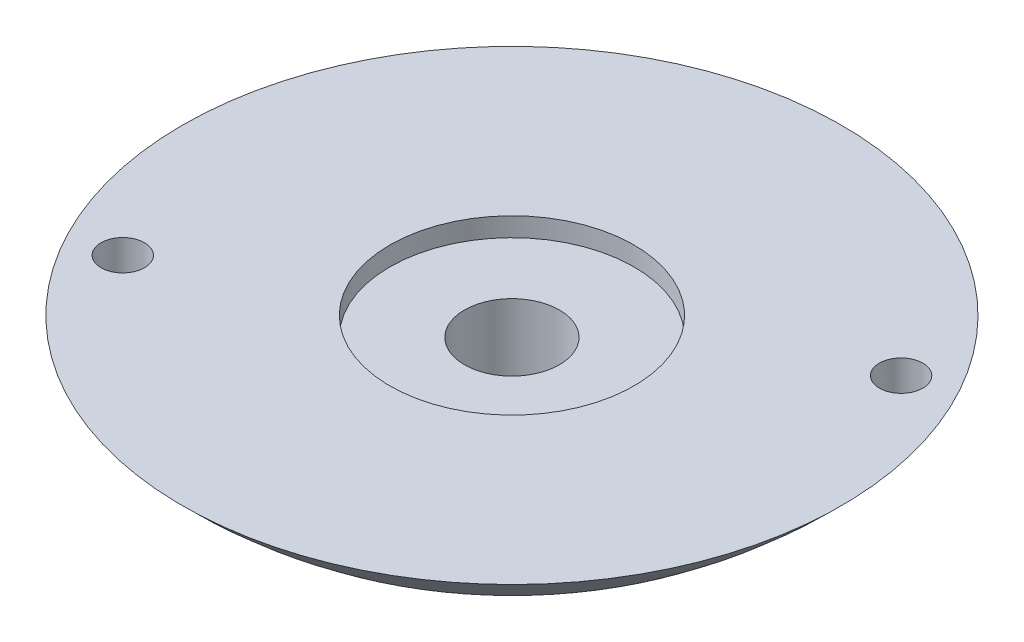
ISO-10303-21;
HEADER;
FILE_DESCRIPTION(('STEP AP214'),'2;1');
FILE_NAME('part.step','',(''),(''),'','','');
FILE_SCHEMA(('AUTOMOTIVE_DESIGN { 1 0 10303 214 1 1 1 1 }'));
ENDSEC;
DATA;
#1=APPLICATION_CONTEXT('core data for automotive mechanical design processes');
#2=APPLICATION_PROTOCOL_DEFINITION('international standard','automotive_design',2000,#1);
#3=PRODUCT_CONTEXT('',#1,'mechanical');
#4=PRODUCT('Part','Part','',(#3));
#5=PRODUCT_RELATED_PRODUCT_CATEGORY('part','',(#4));
#6=PRODUCT_DEFINITION_FORMATION('','',#4);
#7=PRODUCT_DEFINITION_CONTEXT('part definition',#1,'design');
#8=PRODUCT_DEFINITION('design','',#6,#7);
#9=PRODUCT_DEFINITION_SHAPE('','',#8);
#10=(LENGTH_UNIT() NAMED_UNIT(*) SI_UNIT(.MILLI.,.METRE.));
#11=(NAMED_UNIT(*) PLANE_ANGLE_UNIT() SI_UNIT($,.RADIAN.));
#12=(NAMED_UNIT(*) SI_UNIT($,.STERADIAN.) SOLID_ANGLE_UNIT());
#13=UNCERTAINTY_MEASURE_WITH_UNIT(LENGTH_MEASURE(1.E-05),#10,'distance_accuracy_value','');
#14=(GEOMETRIC_REPRESENTATION_CONTEXT(3) GLOBAL_UNCERTAINTY_ASSIGNED_CONTEXT((#13)) GLOBAL_UNIT_ASSIGNED_CONTEXT((#10,
#11,#12)) REPRESENTATION_CONTEXT('',''));
#15=CARTESIAN_POINT('',(0.,0.,0.));
#16=DIRECTION('',(0.,0.,1.));
#17=DIRECTION('',(1.,0.,0.));
#18=AXIS2_PLACEMENT_3D('',#15,#16,#17);
#19=CARTESIAN_POINT('',(0.,0.,0.));
#20=DIRECTION('',(0.,-1.,0.));
#21=DIRECTION('',(-1.,0.,0.));
#22=AXIS2_PLACEMENT_3D('',#19,#20,#21);
#23=SPHERICAL_SURFACE('',#22,33.8);
#24=CARTESIAN_POINT('',(0.,-33.618298588715,0.));
#25=DIRECTION('',(0.,1.,0.));
#26=DIRECTION('',(-1.,0.,0.));
#27=AXIS2_PLACEMENT_3D('',#24,#25,#26);
#28=CIRCLE('',#27,3.5);
#29=CARTESIAN_POINT('',(-3.50000000000002,-33.618298588715,0.));
#30=VERTEX_POINT('',#29);
#31=EDGE_CURVE('E49',#30,#30,#28,.T.);
#32=ORIENTED_EDGE('',*,*,#31,.T.);
#33=EDGE_LOOP('',(#32));
#34=FACE_BOUND('',#33,.T.);
#35=CARTESIAN_POINT('',(16.6632648097952,-27.2764650530501,-10.989543215638));
#36=CARTESIAN_POINT('',(16.6388819187034,-27.3219318471544,-10.9136629667709));
#37=CARTESIAN_POINT('',(16.6197224639966,-27.3650375875773,-10.8345727556679));
#38=CARTESIAN_POINT('',(16.5935628194061,-27.445002891596,-10.6711739972178));
#39=CARTESIAN_POINT('',(16.5865812124553,-27.4818528318753,-10.5868576776768));
#40=CARTESIAN_POINT('',(16.5864859069803,-27.5477613435103,-10.4143132907026));
#41=CARTESIAN_POINT('',(16.5934865381331,-27.5767534617525,-10.3260587904414));
#42=CARTESIAN_POINT('',(16.6228668625863,-27.6246059752164,-10.1493846298961));
#43=CARTESIAN_POINT('',(16.6452218445541,-27.6434825636246,-10.060965462328));
#44=CARTESIAN_POINT('',(16.7013385628951,-27.6678422187828,-9.89960608789244));
#45=CARTESIAN_POINT('',(16.7331267633537,-27.6748017833719,-9.82620044613975));
#46=CARTESIAN_POINT('',(16.8074919946921,-27.6795954683236,-9.68476053480524));
#47=CARTESIAN_POINT('',(16.8500638750466,-27.6774339374286,-9.61672372124072));
#48=CARTESIAN_POINT('',(16.9397813651417,-27.6648009517351,-9.4946198967781));
#49=CARTESIAN_POINT('',(16.986080422171,-27.6551574897174,-9.43983783509275));
#50=CARTESIAN_POINT('',(17.0846118894735,-27.6291055657775,-9.33776008975516));
#51=CARTESIAN_POINT('',(17.1368445890369,-27.6126967739141,-9.29046477138279));
#52=CARTESIAN_POINT('',(17.2478853337098,-27.5730821120982,-9.20224097849064));
#53=CARTESIAN_POINT('',(17.3068766552977,-27.54962155342,-9.16165983190306));
#54=CARTESIAN_POINT('',(17.4278440084385,-27.4971980430601,-9.08955472311624));
#55=CARTESIAN_POINT('',(17.4898212796001,-27.4682327911682,-9.05803456105565));
#56=CARTESIAN_POINT('',(17.6244482998425,-27.4012289331304,-8.9999376393957));
#57=CARTESIAN_POINT('',(17.6973403867625,-27.3624834942516,-8.97474442714659));
#58=CARTESIAN_POINT('',(17.843456856672,-27.2803490784833,-8.93538063505352));
#59=CARTESIAN_POINT('',(17.9166814151794,-27.2369572845756,-8.9212167856893));
#60=CARTESIAN_POINT('',(18.0768633315881,-27.1375008997389,-8.90133443057488));
#61=CARTESIAN_POINT('',(18.1636116682552,-27.0806454909543,-8.89789552339929));
#62=CARTESIAN_POINT('',(18.3340781636343,-26.9633385214959,-8.90453209257335));
#63=CARTESIAN_POINT('',(18.4177944060727,-26.9028847483247,-8.91461596733225));
#64=CARTESIAN_POINT('',(18.597779545109,-26.7668949074548,-8.95050327738525));
#65=CARTESIAN_POINT('',(18.6930830304221,-26.6908167103712,-8.97911632446392));
#66=CARTESIAN_POINT('',(18.8757432285345,-26.5369689784645,-9.05269235487884));
#67=CARTESIAN_POINT('',(18.963092351842,-26.4591979142795,-9.09767075269169));
#68=CARTESIAN_POINT('',(19.139983747697,-26.2924444337985,-9.21025479587591));
#69=CARTESIAN_POINT('',(19.2280518072025,-26.2034499244089,-9.28017707281213));
#70=CARTESIAN_POINT('',(19.3888716861302,-26.027861327424,-9.43835237997544));
#71=CARTESIAN_POINT('',(19.4616280557328,-25.9412665333655,-9.52659994893761));
#72=CARTESIAN_POINT('',(19.5759741563059,-25.7899507975781,-9.70118040558172));
#73=CARTESIAN_POINT('',(19.6208765673715,-25.7242648259357,-9.78451032994022));
#74=CARTESIAN_POINT('',(19.6961956910393,-25.5985205846387,-9.96136333700352));
#75=CARTESIAN_POINT('',(19.7266327741883,-25.5384544972555,-10.0548718562803));
#76=CARTESIAN_POINT('',(19.7653958103,-25.4389603214128,-10.2291976604673));
#77=CARTESIAN_POINT('',(19.7771000283295,-25.3978905954842,-10.3083232957681));
#78=CARTESIAN_POINT('',(19.7883238419953,-25.3226371486301,-10.4706396085337));
#79=CARTESIAN_POINT('',(19.7878578973697,-25.2884453045775,-10.5538253447312));
#80=CARTESIAN_POINT('',(19.7744715704847,-25.2338023953486,-10.7084601601696));
#81=CARTESIAN_POINT('',(19.763594161915,-25.2120199192301,-10.7796115172186));
#82=CARTESIAN_POINT('',(19.731710242437,-25.1758787971339,-10.9215541882542));
#83=CARTESIAN_POINT('',(19.7107094618765,-25.1615159607765,-10.9923456830602));
#84=CARTESIAN_POINT('',(19.6584393384792,-25.141132384262,-11.1317066656503));
#85=CARTESIAN_POINT('',(19.6271234946236,-25.1351500777844,-11.20026451689));
#86=CARTESIAN_POINT('',(19.5550168838905,-25.1321178906762,-11.3324150075984));
#87=CARTESIAN_POINT('',(19.5142277363598,-25.1350664844523,-11.396008493186));
#88=CARTESIAN_POINT('',(19.4281502801507,-25.1490888094048,-11.5115220096015));
#89=CARTESIAN_POINT('',(19.3834508602781,-25.1595189338355,-11.563963957611));
#90=CARTESIAN_POINT('',(19.2887591508307,-25.1871287962971,-11.661781137072));
#91=CARTESIAN_POINT('',(19.2387662362666,-25.2043093319821,-11.7071555325096));
#92=CARTESIAN_POINT('',(19.1320895134155,-25.2456482194559,-11.7926152542159));
#93=CARTESIAN_POINT('',(19.0751878830259,-25.2701430348443,-11.8322629515587));
#94=CARTESIAN_POINT('',(18.9587225067424,-25.3245158839058,-11.9029882451969));
#95=CARTESIAN_POINT('',(18.8991571405072,-25.3543972286215,-11.9340605403827));
#96=CARTESIAN_POINT('',(18.7513896128556,-25.4329671265632,-12.0000371976781));
#97=CARTESIAN_POINT('',(18.6623974407546,-25.484056740392,-12.0303405012513));
#98=CARTESIAN_POINT('',(18.484255882614,-25.5926594391868,-12.0747463347632));
#99=CARTESIAN_POINT('',(18.3951065575218,-25.6501857490757,-12.088814812156));
#100=CARTESIAN_POINT('',(18.1962827235211,-25.7847050483498,-12.1038071644664));
#101=CARTESIAN_POINT('',(18.0871284865329,-25.8629382436689,-12.1004993584796));
#102=CARTESIAN_POINT('',(17.874502421602,-26.023147646793,-12.0729404759186));
#103=CARTESIAN_POINT('',(17.7710319132501,-26.1051247157899,-12.0486845574981));
#104=CARTESIAN_POINT('',(17.5709384647648,-26.2713626328306,-11.9806455271013));
#105=CARTESIAN_POINT('',(17.4743902496609,-26.3556378058109,-11.9366783717097));
#106=CARTESIAN_POINT('',(17.2913325253916,-26.5237806282867,-11.830349760559));
#107=CARTESIAN_POINT('',(17.2048363416282,-26.6076475987515,-11.7679642677142));
#108=CARTESIAN_POINT('',(17.0379309694783,-26.7796236941441,-11.6199017554082));
#109=CARTESIAN_POINT('',(16.9586118419694,-26.8675123688059,-11.5327283269324));
#110=CARTESIAN_POINT('',(16.8192169440146,-27.0368989108538,-11.3393666450534));
#111=CARTESIAN_POINT('',(16.7590538968503,-27.1184244475566,-11.2332681708658));
#112=CARTESIAN_POINT('',(16.6934424624192,-27.2226964158969,-11.076852494087));
#113=CARTESIAN_POINT('',(16.677467505965,-27.2499812755504,-11.0337424090761));
#114=CARTESIAN_POINT('',(16.6632648097952,-27.2764650530501,-10.989543215638));
#115=B_SPLINE_CURVE_WITH_KNOTS('',3,(#35,#36,#37,#38,#39,#40,#41,#42,#43,#44,#45,#46,#47,#48,
#49,#50,#51,#52,#53,#54,#55,#56,#57,#58,#59,#60,#61,#62,#63,#64,#65,#66,#67,#68,#69,#70,#71,#72,
#73,#74,#75,#76,#77,#78,#79,#80,#81,#82,#83,#84,#85,#86,#87,#88,#89,#90,#91,#92,#93,#94,#95,#96,
#97,#98,#99,#100,#101,#102,#103,#104,#105,#106,#107,#108,#109,#110,#111,#112,#113,#114),
.UNSPECIFIED.,.T.,.F.,(4,2,2,2,2,2,2,2,2,2,2,2,2,2,2,2,2,2,2,2,2,2,2,2,2,2,2,2,2,2,2,2,2,2,2,2,
2,2,2,4),(0.,0.275148518467349,0.550716537001907,0.828547039125901,1.10593144463024,
1.34545303204221,1.58486043361745,1.80100164853804,2.01715340578855,2.24231007801532,
2.46756104268989,2.72553800929153,2.98367227881695,3.29387125408295,3.60426296963229,
3.97857663593378,4.35324378376816,4.78151514417209,5.20965905474814,5.55404253132474,
5.89793958818039,6.16669053364503,6.4351221825323,6.65978838578398,6.8843275655124,
7.10989316311979,7.33542023135555,7.54356886217923,7.75174209603455,7.97155590183747,
8.19150528848343,8.51073530362419,8.83063369356404,9.23155456679134,9.63256813175368,
10.0374065575254,10.4427756760896,10.8815712000289,11.3183379376377,11.4786081367145),.UNSPECIFIED.);
#116=CARTESIAN_POINT('',(16.6632648097952,-27.2764650530501,-10.989543215638));
#117=VERTEX_POINT('',#116);
#118=EDGE_CURVE('E55',#117,#117,#115,.T.);
#119=ORIENTED_EDGE('',*,*,#118,.T.);
#120=EDGE_LOOP('',(#119));
#121=FACE_BOUND('',#120,.T.);
#122=CARTESIAN_POINT('',(-18.881368283564,-26.530604954248,9.0587489479538));
#123=CARTESIAN_POINT('',(-18.9769709766965,-26.4468277272112,9.10484035813256));
#124=CARTESIAN_POINT('',(-19.067653084706,-26.3623261518075,9.1602757405241));
#125=CARTESIAN_POINT('',(-19.2370432899048,-26.1938662881118,9.28848769463623));
#126=CARTESIAN_POINT('',(-19.3157099782433,-26.1099107927228,9.36132211240766));
#127=CARTESIAN_POINT('',(-19.4637534574955,-25.9386854280775,9.52933569693268));
#128=CARTESIAN_POINT('',(-19.5319674355394,-25.8516496618856,9.62579364599843));
#129=CARTESIAN_POINT('',(-19.647121846147,-25.6847411629152,9.8359479118933));
#130=CARTESIAN_POINT('',(-19.6941237845895,-25.6048482661445,9.94959309690193));
#131=CARTESIAN_POINT('',(-19.749163435173,-25.4843960693713,10.1471487271275));
#132=CARTESIAN_POINT('',(-19.7651727294473,-25.4401722981911,10.2266365580922));
#133=CARTESIAN_POINT('',(-19.7848973230835,-25.3583438826033,10.3904125218754));
#134=CARTESIAN_POINT('',(-19.7886307859385,-25.3207295369293,10.4746933747196));
#135=CARTESIAN_POINT('',(-19.7826877428494,-25.2596816281254,10.6320113043976));
#136=CARTESIAN_POINT('',(-19.7751192176688,-25.2349327272564,10.7046131622402));
#137=CARTESIAN_POINT('',(-19.7494939390021,-25.1928111953391,10.8501449599258));
#138=CARTESIAN_POINT('',(-19.7314422128795,-25.175435035499,10.9230747258928));
#139=CARTESIAN_POINT('',(-19.6844631413943,-25.1491447423437,11.0674476751292));
#140=CARTESIAN_POINT('',(-19.6554754953051,-25.1402785115779,11.1388802543641));
#141=CARTESIAN_POINT('',(-19.5871982005101,-25.1318881194044,11.2772260910207));
#142=CARTESIAN_POINT('',(-19.5479124406902,-25.1323604364731,11.3441410424682));
#143=CARTESIAN_POINT('',(-19.4646919111072,-25.1420968492021,11.4649733661724));
#144=CARTESIAN_POINT('',(-19.4215650479428,-25.150512913445,11.5195218121386));
#145=CARTESIAN_POINT('',(-19.329529087066,-25.1743802459428,11.6217364045022));
#146=CARTESIAN_POINT('',(-19.2806195471534,-25.1898320524776,11.669402023951));
#147=CARTESIAN_POINT('',(-19.1767982132987,-25.2275549665017,11.7586604479044));
#148=CARTESIAN_POINT('',(-19.1217372011917,-25.2500437273032,11.7999857374253));
#149=CARTESIAN_POINT('',(-19.0086406104459,-25.3005448098468,11.8743101655591));
#150=CARTESIAN_POINT('',(-18.9506033684958,-25.3285602457091,11.9073045859629));
#151=CARTESIAN_POINT('',(-18.8074075676976,-25.4021450822658,11.9776091987163));
#152=CARTESIAN_POINT('',(-18.7213500404122,-25.4500733975535,12.0106406610019));
#153=CARTESIAN_POINT('',(-18.5485585923413,-25.5525201688116,12.0611137449661));
#154=CARTESIAN_POINT('',(-18.4618236452,-25.6070519609639,12.0785232002491));
#155=CARTESIAN_POINT('',(-18.2670550534188,-25.7355842161118,12.1017147774204));
#156=CARTESIAN_POINT('',(-18.1594086127212,-25.8109370447572,12.1032437914949));
#157=CARTESIAN_POINT('',(-17.9490151796428,-25.9658161081887,12.0857943092723));
#158=CARTESIAN_POINT('',(-17.8462702971445,-26.0453441097909,12.0668070634229));
#159=CARTESIAN_POINT('',(-17.64661127474,-26.2072558217717,12.0097616320324));
#160=CARTESIAN_POINT('',(-17.549776934897,-26.2896617488208,11.9714885581018));
#161=CARTESIAN_POINT('',(-17.3652342060552,-26.4545325470169,11.877032678643));
#162=CARTESIAN_POINT('',(-17.2775313559803,-26.5369974237405,11.8208390859835));
#163=CARTESIAN_POINT('',(-17.1050131846903,-26.7085511911863,11.684742651944));
#164=CARTESIAN_POINT('',(-17.0214472832261,-26.7974367787676,11.6029815412761));
#165=CARTESIAN_POINT('',(-16.8721259620795,-26.9699503711144,11.4199151468431));
#166=CARTESIAN_POINT('',(-16.8063466875788,-27.0535853010554,11.3186363550976));
#167=CARTESIAN_POINT('',(-16.7137630255733,-27.1881865983807,11.131180853548));
#168=CARTESIAN_POINT('',(-16.6811855641099,-27.2414626421067,11.0494935712048));
#169=CARTESIAN_POINT('',(-16.6293743303012,-27.3418000770915,10.8784345241948));
#170=CARTESIAN_POINT('',(-16.6101201725973,-27.3888708729703,10.7890747354327));
#171=CARTESIAN_POINT('',(-16.5892545766881,-27.467139718676,10.620734637382));
#172=CARTESIAN_POINT('',(-16.5851372465992,-27.4996734836507,10.5426901065562));
#173=CARTESIAN_POINT('',(-16.5887641608365,-27.557714990038,10.3842360861256));
#174=CARTESIAN_POINT('',(-16.5965045120276,-27.5832250342473,10.303827381231));
#175=CARTESIAN_POINT('',(-16.6248474638165,-27.6259646243557,10.1423739894689));
#176=CARTESIAN_POINT('',(-16.6455408009639,-27.643134225063,10.0613288328073));
#177=CARTESIAN_POINT('',(-16.7000263032866,-27.6677158444423,9.9022134220718));
#178=CARTESIAN_POINT('',(-16.7338082088237,-27.6751354857859,9.82414089038263));
#179=CARTESIAN_POINT('',(-16.8085833313326,-27.6793878547326,9.68341720354441));
#180=CARTESIAN_POINT('',(-16.8481753800627,-27.6774122644436,9.62005113469646));
#181=CARTESIAN_POINT('',(-16.9353877159793,-27.6656737887932,9.49993031618041));
#182=CARTESIAN_POINT('',(-16.98300682181,-27.6559120485453,9.44317459573125));
#183=CARTESIAN_POINT('',(-17.0832252391756,-27.6295270682891,9.33905260362643));
#184=CARTESIAN_POINT('',(-17.1356584539317,-27.6130931823585,9.29147679012267));
#185=CARTESIAN_POINT('',(-17.2448876925784,-27.5741778534207,9.20455419760293));
#186=CARTESIAN_POINT('',(-17.3016848624189,-27.5516948180369,9.16520959022223));
#187=CARTESIAN_POINT('',(-17.423870009374,-27.4990922449422,9.09148051195493));
#188=CARTESIAN_POINT('',(-17.4895522938874,-27.46843763643,9.05797036664656));
#189=CARTESIAN_POINT('',(-17.6226255997295,-27.4020612157817,9.00091440749397));
#190=CARTESIAN_POINT('',(-17.6900173707823,-27.3663371476548,8.97737304860259));
#191=CARTESIAN_POINT('',(-17.8372386739358,-27.2841047798455,8.93640587995824));
#192=CARTESIAN_POINT('',(-17.9171395243937,-27.2368100102587,8.92082373506539));
#193=CARTESIAN_POINT('',(-18.0758000748939,-27.1380110616766,8.90183410358686));
#194=CARTESIAN_POINT('',(-18.1545584772209,-27.0865024791183,8.89843952398911));
#195=CARTESIAN_POINT('',(-18.3261085245024,-26.9691948728321,8.9033276393243));
#196=CARTESIAN_POINT('',(-18.4183346478741,-26.902681609333,8.91423905915861));
#197=CARTESIAN_POINT('',(-18.5974532273791,-26.7669161922166,8.95097070241018));
#198=CARTESIAN_POINT('',(-18.6843517474853,-26.6976673057876,8.97677361396217));
#199=CARTESIAN_POINT('',(-18.8064485860729,-26.595499537836,9.0243925062386));
#200=CARTESIAN_POINT('',(-18.8442787313805,-26.5631067565734,9.04086755040083));
#201=CARTESIAN_POINT('',(-18.881368283564,-26.530604954248,9.0587489479538));
#202=B_SPLINE_CURVE_WITH_KNOTS('',3,(#122,#123,#124,#125,#126,#127,#128,#129,#130,#131,#132,
#133,#134,#135,#136,#137,#138,#139,#140,#141,#142,#143,#144,#145,#146,#147,#148,#149,#150,#151,
#152,#153,#154,#155,#156,#157,#158,#159,#160,#161,#162,#163,#164,#165,#166,#167,#168,#169,#170,
#171,#172,#173,#174,#175,#176,#177,#178,#179,#180,#181,#182,#183,#184,#185,#186,#187,#188,#189,
#190,#191,#192,#193,#194,#195,#196,#197,#198,#199,#200,#201),.UNSPECIFIED.,.T.,.F.,(4,2,2,2,2,2,
2,2,2,2,2,2,2,2,2,2,2,2,2,2,2,2,2,2,2,2,2,2,2,2,2,2,2,2,2,2,2,2,2,4),(0.,0.405512550533919,
0.812392534367096,1.25024137310457,1.6868123487793,1.96293019356779,2.23863930621976,
2.46892479582884,2.69909993994956,2.93056327475356,3.16193932745633,3.37111193251121,
3.58030054331716,3.79673449450373,4.0132907500484,4.32327023319619,4.63388652273891,
5.0260592185919,5.4183992300455,5.81521080742212,6.21226169505197,6.65061569653512,
7.08837884327253,7.39572837113056,7.70260659191896,7.9555535739763,8.20841752582363,
8.46307294057993,8.71752914304181,8.94063659027652,9.16371123102401,9.38085416673207,
9.59805431911451,9.83671732694247,10.0754868786563,10.3569089975597,10.6386290629476,
10.9800861688496,11.3211471165856,11.4784677778692),.UNSPECIFIED.);
#203=CARTESIAN_POINT('',(-18.881368283564,-26.530604954248,9.0587489479538));
#204=VERTEX_POINT('',#203);
#205=EDGE_CURVE('E52',#204,#204,#202,.T.);
#206=ORIENTED_EDGE('',*,*,#205,.T.);
#207=EDGE_LOOP('',(#206));
#208=FACE_BOUND('',#207,.T.);
#209=CARTESIAN_POINT('',(0.,-23.5,0.));
#210=DIRECTION('',(0.,1.,0.));
#211=DIRECTION('',(-1.,0.,0.));
#212=AXIS2_PLACEMENT_3D('',#209,#210,#211);
#213=CIRCLE('',#212,24.2938263762627);
#214=CARTESIAN_POINT('',(-24.2938263762628,-23.5,0.));
#215=VERTEX_POINT('',#214);
#216=EDGE_CURVE('E63',#215,#215,#213,.T.);
#217=ORIENTED_EDGE('',*,*,#216,.F.);
#218=EDGE_LOOP('',(#217));
#219=FACE_BOUND('',#218,.T.);
#220=ADVANCED_FACE('F37',(#34,#121,#208,#219),#23,.T.);
#221=CARTESIAN_POINT('',(18.1865334794732,-33.619298588715,-10.5));
#222=DIRECTION('',(0.,1.,0.));
#223=DIRECTION('',(0.,0.,1.));
#224=AXIS2_PLACEMENT_3D('',#221,#222,#223);
#225=CYLINDRICAL_SURFACE('',#224,1.6);
#226=ORIENTED_EDGE('',*,*,#118,.F.);
#227=EDGE_LOOP('',(#226));
#228=FACE_BOUND('',#227,.T.);
#229=CARTESIAN_POINT('',(18.1865334794732,-23.5,-10.5));
#230=DIRECTION('',(0.,1.,0.));
#231=DIRECTION('',(-1.,0.,0.));
#232=AXIS2_PLACEMENT_3D('',#229,#230,#231);
#233=CIRCLE('',#232,1.6);
#234=CARTESIAN_POINT('',(16.5865334794732,-23.5,-10.5));
#235=VERTEX_POINT('',#234);
#236=EDGE_CURVE('E110',#235,#235,#233,.T.);
#237=ORIENTED_EDGE('',*,*,#236,.T.);
#238=EDGE_LOOP('',(#237));
#239=FACE_BOUND('',#238,.T.);
#240=ADVANCED_FACE('F70',(#228,#239),#225,.F.);
#241=CARTESIAN_POINT('',(-18.1865334794732,-33.619298588715,10.5));
#242=DIRECTION('',(0.,1.,0.));
#243=DIRECTION('',(0.,0.,1.));
#244=AXIS2_PLACEMENT_3D('',#241,#242,#243);
#245=CYLINDRICAL_SURFACE('',#244,1.6);
#246=ORIENTED_EDGE('',*,*,#205,.F.);
#247=EDGE_LOOP('',(#246));
#248=FACE_BOUND('',#247,.T.);
#249=CARTESIAN_POINT('',(-18.1865334794732,-23.5,10.5));
#250=DIRECTION('',(0.,1.,0.));
#251=DIRECTION('',(-1.,0.,0.));
#252=AXIS2_PLACEMENT_3D('',#249,#250,#251);
#253=CIRCLE('',#252,1.6);
#254=CARTESIAN_POINT('',(-19.7865334794732,-23.5,10.5));
#255=VERTEX_POINT('',#254);
#256=EDGE_CURVE('E112',#255,#255,#253,.T.);
#257=ORIENTED_EDGE('',*,*,#256,.T.);
#258=EDGE_LOOP('',(#257));
#259=FACE_BOUND('',#258,.T.);
#260=ADVANCED_FACE('F87',(#248,#259),#245,.F.);
#261=CARTESIAN_POINT('',(0.,-23.5,0.));
#262=DIRECTION('',(0.,-1.,0.));
#263=DIRECTION('',(1.,0.,0.));
#264=AXIS2_PLACEMENT_3D('',#261,#262,#263);
#265=PLANE('',#264);
#266=CARTESIAN_POINT('',(0.,-23.5,0.));
#267=DIRECTION('',(0.,1.,0.));
#268=DIRECTION('',(-1.,0.,0.));
#269=AXIS2_PLACEMENT_3D('',#266,#267,#268);
#270=CIRCLE('',#269,9.);
#271=CARTESIAN_POINT('',(-9.00000000000001,-23.5,0.));
#272=VERTEX_POINT('',#271);
#273=EDGE_CURVE('E40',#272,#272,#270,.T.);
#274=ORIENTED_EDGE('',*,*,#273,.F.);
#275=EDGE_LOOP('',(#274));
#276=FACE_BOUND('',#275,.T.);
#277=ORIENTED_EDGE('',*,*,#216,.T.);
#278=EDGE_LOOP('',(#277));
#279=FACE_BOUND('',#278,.T.);
#280=ORIENTED_EDGE('',*,*,#236,.F.);
#281=EDGE_LOOP('',(#280));
#282=FACE_BOUND('',#281,.T.);
#283=ORIENTED_EDGE('',*,*,#256,.F.);
#284=EDGE_LOOP('',(#283));
#285=FACE_BOUND('',#284,.T.);
#286=ADVANCED_FACE('F84',(#276,#279,#282,#285),#265,.F.);
#287=CARTESIAN_POINT('',(0.,-24.9,0.));
#288=DIRECTION('',(0.,1.,0.));
#289=DIRECTION('',(-1.,0.,0.));
#290=AXIS2_PLACEMENT_3D('',#287,#288,#289);
#291=CYLINDRICAL_SURFACE('',#290,9.);
#292=CARTESIAN_POINT('',(0.,-24.9,0.));
#293=DIRECTION('',(0.,1.,0.));
#294=DIRECTION('',(-1.,0.,0.));
#295=AXIS2_PLACEMENT_3D('',#292,#293,#294);
#296=CIRCLE('',#295,9.);
#297=CARTESIAN_POINT('',(-9.00000000000001,-24.9,0.));
#298=VERTEX_POINT('',#297);
#299=EDGE_CURVE('E10',#298,#298,#296,.T.);
#300=ORIENTED_EDGE('',*,*,#299,.F.);
#301=EDGE_LOOP('',(#300));
#302=FACE_BOUND('',#301,.T.);
#303=ORIENTED_EDGE('',*,*,#273,.T.);
#304=EDGE_LOOP('',(#303));
#305=FACE_BOUND('',#304,.T.);
#306=ADVANCED_FACE('F81',(#302,#305),#291,.F.);
#307=CARTESIAN_POINT('',(0.,-24.9,0.));
#308=DIRECTION('',(0.,1.,0.));
#309=DIRECTION('',(-1.,0.,0.));
#310=AXIS2_PLACEMENT_3D('',#307,#308,#309);
#311=PLANE('',#310);
#312=CARTESIAN_POINT('',(0.,-24.9,0.));
#313=DIRECTION('',(0.,1.,0.));
#314=DIRECTION('',(-1.,0.,0.));
#315=AXIS2_PLACEMENT_3D('',#312,#313,#314);
#316=CIRCLE('',#315,3.5);
#317=CARTESIAN_POINT('',(-3.50000000000002,-24.9,0.));
#318=VERTEX_POINT('',#317);
#319=EDGE_CURVE('E47',#318,#318,#316,.T.);
#320=ORIENTED_EDGE('',*,*,#319,.F.);
#321=EDGE_LOOP('',(#320));
#322=FACE_BOUND('',#321,.T.);
#323=ORIENTED_EDGE('',*,*,#299,.T.);
#324=EDGE_LOOP('',(#323));
#325=FACE_BOUND('',#324,.T.);
#326=ADVANCED_FACE('F77',(#322,#325),#311,.T.);
#327=CARTESIAN_POINT('',(0.,-33.801,0.));
#328=DIRECTION('',(0.,1.,0.));
#329=DIRECTION('',(-1.,0.,0.));
#330=AXIS2_PLACEMENT_3D('',#327,#328,#329);
#331=CYLINDRICAL_SURFACE('',#330,3.5);
#332=ORIENTED_EDGE('',*,*,#31,.F.);
#333=EDGE_LOOP('',(#332));
#334=FACE_BOUND('',#333,.T.);
#335=ORIENTED_EDGE('',*,*,#319,.T.);
#336=EDGE_LOOP('',(#335));
#337=FACE_BOUND('',#336,.T.);
#338=ADVANCED_FACE('F74',(#334,#337),#331,.F.);
#339=CLOSED_SHELL('',(#220,#240,#260,#286,#306,#326,#338));
#340=MANIFOLD_SOLID_BREP('B2',#339);
#341=ADVANCED_BREP_SHAPE_REPRESENTATION('',(#18,#340),#14);
#342=SHAPE_DEFINITION_REPRESENTATION(#9,#341);
ENDSEC;
END-ISO-10303-21;
